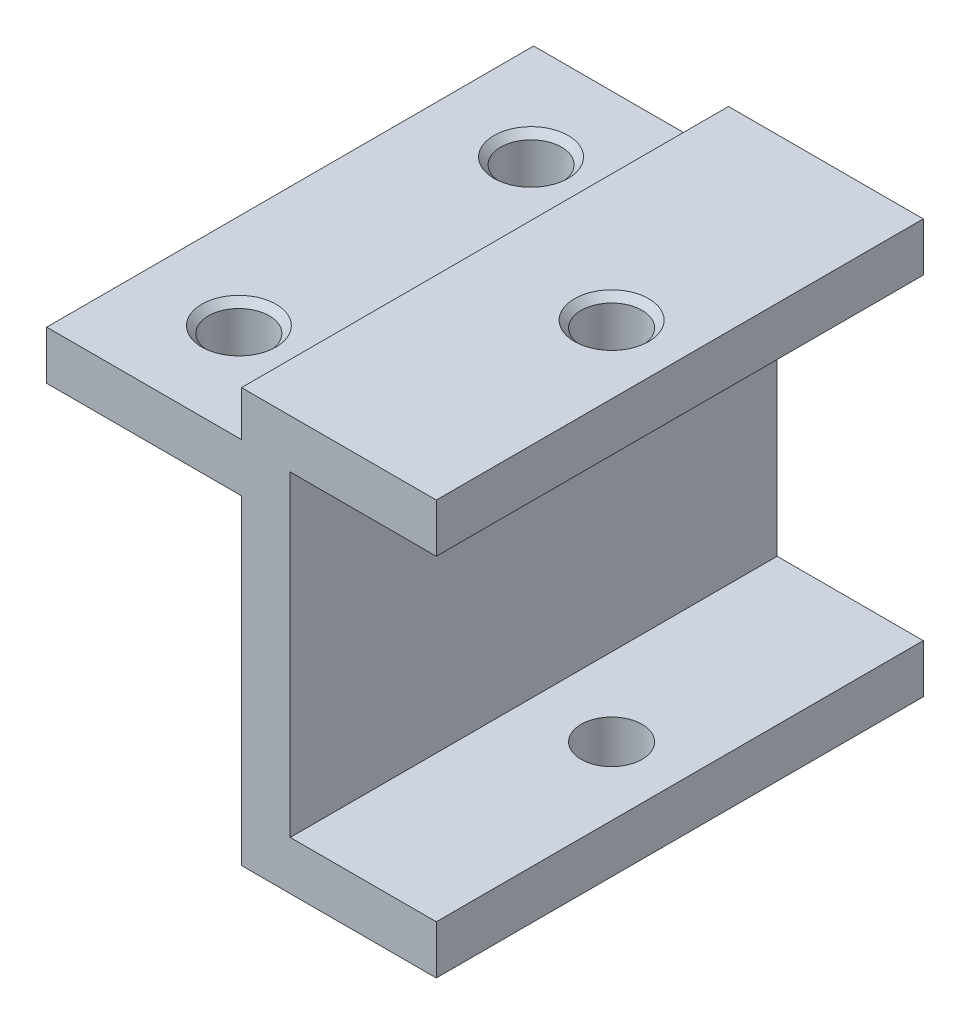
ISO-10303-21;
HEADER;
FILE_DESCRIPTION(('STEP AP214'),'2;1');
FILE_NAME('part.step','',(''),(''),'','','');
FILE_SCHEMA(('AUTOMOTIVE_DESIGN { 1 0 10303 214 1 1 1 1 }'));
ENDSEC;
DATA;
#1=APPLICATION_CONTEXT('core data for automotive mechanical design processes');
#2=APPLICATION_PROTOCOL_DEFINITION('international standard','automotive_design',2000,#1);
#3=PRODUCT_CONTEXT('',#1,'mechanical');
#4=PRODUCT('Part','Part','',(#3));
#5=PRODUCT_RELATED_PRODUCT_CATEGORY('part','',(#4));
#6=PRODUCT_DEFINITION_FORMATION('','',#4);
#7=PRODUCT_DEFINITION_CONTEXT('part definition',#1,'design');
#8=PRODUCT_DEFINITION('design','',#6,#7);
#9=PRODUCT_DEFINITION_SHAPE('','',#8);
#10=(LENGTH_UNIT() NAMED_UNIT(*) SI_UNIT(.MILLI.,.METRE.));
#11=(NAMED_UNIT(*) PLANE_ANGLE_UNIT() SI_UNIT($,.RADIAN.));
#12=(NAMED_UNIT(*) SI_UNIT($,.STERADIAN.) SOLID_ANGLE_UNIT());
#13=UNCERTAINTY_MEASURE_WITH_UNIT(LENGTH_MEASURE(1.E-05),#10,'distance_accuracy_value','');
#14=(GEOMETRIC_REPRESENTATION_CONTEXT(3) GLOBAL_UNCERTAINTY_ASSIGNED_CONTEXT((#13)) GLOBAL_UNIT_ASSIGNED_CONTEXT((#10,
#11,#12)) REPRESENTATION_CONTEXT('',''));
#15=CARTESIAN_POINT('',(0.,0.,0.));
#16=DIRECTION('',(0.,0.,1.));
#17=DIRECTION('',(1.,0.,0.));
#18=AXIS2_PLACEMENT_3D('',#15,#16,#17);
#19=CARTESIAN_POINT('',(4.,5.1,20.));
#20=DIRECTION('',(-1.,0.,0.));
#21=DIRECTION('',(0.,0.,1.));
#22=AXIS2_PLACEMENT_3D('',#19,#20,#21);
#23=PLANE('',#22);
#24=DIRECTION('',(0.,1.,0.));
#25=VECTOR('',#24,1.);
#26=CARTESIAN_POINT('',(4.,5.1,0.));
#27=LINE('',#26,#25);
#28=CARTESIAN_POINT('',(4.,5.1,0.));
#29=VERTEX_POINT('',#28);
#30=CARTESIAN_POINT('',(4.,7.1,0.));
#31=VERTEX_POINT('',#30);
#32=EDGE_CURVE('E156',#29,#31,#27,.T.);
#33=ORIENTED_EDGE('',*,*,#32,.T.);
#34=DIRECTION('',(0.,0.,-1.));
#35=VECTOR('',#34,1.);
#36=CARTESIAN_POINT('',(4.,7.1,20.));
#37=LINE('',#36,#35);
#38=CARTESIAN_POINT('',(4.,7.1,20.));
#39=VERTEX_POINT('',#38);
#40=EDGE_CURVE('E11',#39,#31,#37,.T.);
#41=ORIENTED_EDGE('',*,*,#40,.F.);
#42=DIRECTION('',(0.,1.,0.));
#43=VECTOR('',#42,1.);
#44=CARTESIAN_POINT('',(4.,5.1,20.));
#45=LINE('',#44,#43);
#46=CARTESIAN_POINT('',(4.,5.1,20.));
#47=VERTEX_POINT('',#46);
#48=EDGE_CURVE('E181',#47,#39,#45,.T.);
#49=ORIENTED_EDGE('',*,*,#48,.F.);
#50=DIRECTION('',(0.,0.,-1.));
#51=VECTOR('',#50,1.);
#52=CARTESIAN_POINT('',(4.,5.1,20.));
#53=LINE('',#52,#51);
#54=EDGE_CURVE('E152',#47,#29,#53,.T.);
#55=ORIENTED_EDGE('',*,*,#54,.T.);
#56=EDGE_LOOP('',(#33,#41,#49,#55));
#57=FACE_BOUND('',#56,.T.);
#58=ADVANCED_FACE('F34',(#57),#23,.F.);
#59=CARTESIAN_POINT('',(-4.,7.1,20.));
#60=DIRECTION('',(0.,-1.,0.));
#61=DIRECTION('',(0.,0.,-1.));
#62=AXIS2_PLACEMENT_3D('',#59,#60,#61);
#63=PLANE('',#62);
#64=CARTESIAN_POINT('',(1.2,7.1,10.));
#65=DIRECTION('',(0.,1.,0.));
#66=DIRECTION('',(0.,0.,1.));
#67=AXIS2_PLACEMENT_3D('',#64,#65,#66);
#68=CIRCLE('',#67,1.525);
#69=CARTESIAN_POINT('',(1.2,7.1,11.525));
#70=VERTEX_POINT('',#69);
#71=EDGE_CURVE('E476',#70,#70,#68,.T.);
#72=ORIENTED_EDGE('',*,*,#71,.F.);
#73=EDGE_LOOP('',(#72));
#74=FACE_BOUND('',#73,.T.);
#75=DIRECTION('',(-1.,0.,0.));
#76=VECTOR('',#75,1.);
#77=CARTESIAN_POINT('',(-4.,7.1,0.));
#78=LINE('',#77,#76);
#79=CARTESIAN_POINT('',(-4.,7.1,0.));
#80=VERTEX_POINT('',#79);
#81=EDGE_CURVE('E159',#31,#80,#78,.T.);
#82=ORIENTED_EDGE('',*,*,#81,.T.);
#83=DIRECTION('',(0.,0.,-1.));
#84=VECTOR('',#83,1.);
#85=CARTESIAN_POINT('',(-4.,7.1,20.));
#86=LINE('',#85,#84);
#87=CARTESIAN_POINT('',(-4.,7.1,20.));
#88=VERTEX_POINT('',#87);
#89=EDGE_CURVE('E43',#88,#80,#86,.T.);
#90=ORIENTED_EDGE('',*,*,#89,.F.);
#91=DIRECTION('',(-1.,0.,0.));
#92=VECTOR('',#91,1.);
#93=CARTESIAN_POINT('',(-4.,7.1,20.));
#94=LINE('',#93,#92);
#95=EDGE_CURVE('E105',#39,#88,#94,.T.);
#96=ORIENTED_EDGE('',*,*,#95,.F.);
#97=ORIENTED_EDGE('',*,*,#40,.T.);
#98=EDGE_LOOP('',(#82,#90,#96,#97));
#99=FACE_BOUND('',#98,.T.);
#100=ADVANCED_FACE('F258',(#74,#99),#63,.F.);
#101=CARTESIAN_POINT('',(-4.,5.25,20.));
#102=DIRECTION('',(1.,0.,0.));
#103=DIRECTION('',(0.,1.,0.));
#104=AXIS2_PLACEMENT_3D('',#101,#102,#103);
#105=PLANE('',#104);
#106=DIRECTION('',(0.,-1.,0.));
#107=VECTOR('',#106,1.);
#108=CARTESIAN_POINT('',(-4.,5.25,0.));
#109=LINE('',#108,#107);
#110=CARTESIAN_POINT('',(-4.,5.25,0.));
#111=VERTEX_POINT('',#110);
#112=EDGE_CURVE('E162',#80,#111,#109,.T.);
#113=ORIENTED_EDGE('',*,*,#112,.T.);
#114=DIRECTION('',(0.,0.,-1.));
#115=VECTOR('',#114,1.);
#116=CARTESIAN_POINT('',(-4.,5.25,20.));
#117=LINE('',#116,#115);
#118=CARTESIAN_POINT('',(-4.,5.25,20.));
#119=VERTEX_POINT('',#118);
#120=EDGE_CURVE('E200',#119,#111,#117,.T.);
#121=ORIENTED_EDGE('',*,*,#120,.F.);
#122=DIRECTION('',(0.,-1.,0.));
#123=VECTOR('',#122,1.);
#124=CARTESIAN_POINT('',(-4.,5.25,20.));
#125=LINE('',#124,#123);
#126=EDGE_CURVE('E229',#88,#119,#125,.T.);
#127=ORIENTED_EDGE('',*,*,#126,.F.);
#128=ORIENTED_EDGE('',*,*,#89,.T.);
#129=EDGE_LOOP('',(#113,#121,#127,#128));
#130=FACE_BOUND('',#129,.T.);
#131=ADVANCED_FACE('F261',(#130),#105,.F.);
#132=CARTESIAN_POINT('',(-4.,5.25,20.));
#133=DIRECTION('',(0.,-1.,0.));
#134=DIRECTION('',(1.,0.,0.));
#135=AXIS2_PLACEMENT_3D('',#132,#133,#134);
#136=PLANE('',#135);
#137=CARTESIAN_POINT('',(-8.10837191308821,5.25,4.));
#138=DIRECTION('',(0.,1.,0.));
#139=DIRECTION('',(0.,0.,1.));
#140=AXIS2_PLACEMENT_3D('',#137,#138,#139);
#141=CIRCLE('',#140,1.525);
#142=CARTESIAN_POINT('',(-8.10837191308821,5.25,5.525));
#143=VERTEX_POINT('',#142);
#144=EDGE_CURVE('E216',#143,#143,#141,.T.);
#145=ORIENTED_EDGE('',*,*,#144,.F.);
#146=EDGE_LOOP('',(#145));
#147=FACE_BOUND('',#146,.T.);
#148=CARTESIAN_POINT('',(-8.10837191308821,5.25,16.));
#149=DIRECTION('',(0.,1.,0.));
#150=DIRECTION('',(0.,0.,1.));
#151=AXIS2_PLACEMENT_3D('',#148,#149,#150);
#152=CIRCLE('',#151,1.525);
#153=CARTESIAN_POINT('',(-8.10837191308821,5.25,17.525));
#154=VERTEX_POINT('',#153);
#155=EDGE_CURVE('E209',#154,#154,#152,.T.);
#156=ORIENTED_EDGE('',*,*,#155,.F.);
#157=EDGE_LOOP('',(#156));
#158=FACE_BOUND('',#157,.T.);
#159=DIRECTION('',(-1.,0.,0.));
#160=VECTOR('',#159,1.);
#161=CARTESIAN_POINT('',(-4.,5.25,0.));
#162=LINE('',#161,#160);
#163=CARTESIAN_POINT('',(-12.,5.25,0.));
#164=VERTEX_POINT('',#163);
#165=EDGE_CURVE('E164',#111,#164,#162,.T.);
#166=ORIENTED_EDGE('',*,*,#165,.T.);
#167=DIRECTION('',(0.,0.,-1.));
#168=VECTOR('',#167,1.);
#169=CARTESIAN_POINT('',(-12.,5.25,20.));
#170=LINE('',#169,#168);
#171=CARTESIAN_POINT('',(-12.,5.25,20.));
#172=VERTEX_POINT('',#171);
#173=EDGE_CURVE('E197',#172,#164,#170,.T.);
#174=ORIENTED_EDGE('',*,*,#173,.F.);
#175=DIRECTION('',(-1.,0.,0.));
#176=VECTOR('',#175,1.);
#177=CARTESIAN_POINT('',(-4.,5.25,20.));
#178=LINE('',#177,#176);
#179=EDGE_CURVE('E231',#119,#172,#178,.T.);
#180=ORIENTED_EDGE('',*,*,#179,.F.);
#181=ORIENTED_EDGE('',*,*,#120,.T.);
#182=EDGE_LOOP('',(#166,#174,#180,#181));
#183=FACE_BOUND('',#182,.T.);
#184=ADVANCED_FACE('F266',(#147,#158,#183),#136,.F.);
#185=CARTESIAN_POINT('',(-12.,5.25,20.));
#186=DIRECTION('',(1.,0.,0.));
#187=DIRECTION('',(0.,1.,0.));
#188=AXIS2_PLACEMENT_3D('',#185,#186,#187);
#189=PLANE('',#188);
#190=DIRECTION('',(0.,-1.,0.));
#191=VECTOR('',#190,1.);
#192=CARTESIAN_POINT('',(-12.,5.25,0.));
#193=LINE('',#192,#191);
#194=CARTESIAN_POINT('',(-12.,3.25,0.));
#195=VERTEX_POINT('',#194);
#196=EDGE_CURVE('E166',#164,#195,#193,.T.);
#197=ORIENTED_EDGE('',*,*,#196,.T.);
#198=DIRECTION('',(0.,0.,-1.));
#199=VECTOR('',#198,1.);
#200=CARTESIAN_POINT('',(-12.,3.25,20.));
#201=LINE('',#200,#199);
#202=CARTESIAN_POINT('',(-12.,3.25,20.));
#203=VERTEX_POINT('',#202);
#204=EDGE_CURVE('E194',#203,#195,#201,.T.);
#205=ORIENTED_EDGE('',*,*,#204,.F.);
#206=DIRECTION('',(0.,-1.,0.));
#207=VECTOR('',#206,1.);
#208=CARTESIAN_POINT('',(-12.,5.25,20.));
#209=LINE('',#208,#207);
#210=EDGE_CURVE('E233',#172,#203,#209,.T.);
#211=ORIENTED_EDGE('',*,*,#210,.F.);
#212=ORIENTED_EDGE('',*,*,#173,.T.);
#213=EDGE_LOOP('',(#197,#205,#211,#212));
#214=FACE_BOUND('',#213,.T.);
#215=ADVANCED_FACE('F272',(#214),#189,.F.);
#216=CARTESIAN_POINT('',(-4.,3.25,20.));
#217=DIRECTION('',(0.,1.,0.));
#218=DIRECTION('',(-1.,0.,0.));
#219=AXIS2_PLACEMENT_3D('',#216,#217,#218);
#220=PLANE('',#219);
#221=CARTESIAN_POINT('',(-8.10837191308821,3.25,4.));
#222=DIRECTION('',(0.,1.,0.));
#223=DIRECTION('',(-1.,0.,0.));
#224=AXIS2_PLACEMENT_3D('',#221,#222,#223);
#225=CIRCLE('',#224,1.24999999999999);
#226=CARTESIAN_POINT('',(-9.3583719130882,3.25,4.));
#227=VERTEX_POINT('',#226);
#228=EDGE_CURVE('E207',#227,#227,#225,.T.);
#229=ORIENTED_EDGE('',*,*,#228,.T.);
#230=EDGE_LOOP('',(#229));
#231=FACE_BOUND('',#230,.T.);
#232=CARTESIAN_POINT('',(-8.10837191308821,3.25,16.));
#233=DIRECTION('',(0.,1.,0.));
#234=DIRECTION('',(-1.,0.,0.));
#235=AXIS2_PLACEMENT_3D('',#232,#233,#234);
#236=CIRCLE('',#235,1.24999999999999);
#237=CARTESIAN_POINT('',(-9.3583719130882,3.25,16.));
#238=VERTEX_POINT('',#237);
#239=EDGE_CURVE('E160',#238,#238,#236,.T.);
#240=ORIENTED_EDGE('',*,*,#239,.T.);
#241=EDGE_LOOP('',(#240));
#242=FACE_BOUND('',#241,.T.);
#243=DIRECTION('',(1.,0.,0.));
#244=VECTOR('',#243,1.);
#245=CARTESIAN_POINT('',(-4.,3.25,0.));
#246=LINE('',#245,#244);
#247=CARTESIAN_POINT('',(-4.,3.25,0.));
#248=VERTEX_POINT('',#247);
#249=EDGE_CURVE('E168',#195,#248,#246,.T.);
#250=ORIENTED_EDGE('',*,*,#249,.T.);
#251=DIRECTION('',(0.,0.,-1.));
#252=VECTOR('',#251,1.);
#253=CARTESIAN_POINT('',(-4.,3.25,20.));
#254=LINE('',#253,#252);
#255=CARTESIAN_POINT('',(-4.,3.25,20.));
#256=VERTEX_POINT('',#255);
#257=EDGE_CURVE('E191',#256,#248,#254,.T.);
#258=ORIENTED_EDGE('',*,*,#257,.F.);
#259=DIRECTION('',(1.,0.,0.));
#260=VECTOR('',#259,1.);
#261=CARTESIAN_POINT('',(-4.,3.25,20.));
#262=LINE('',#261,#260);
#263=EDGE_CURVE('E235',#203,#256,#262,.T.);
#264=ORIENTED_EDGE('',*,*,#263,.F.);
#265=ORIENTED_EDGE('',*,*,#204,.T.);
#266=EDGE_LOOP('',(#250,#258,#264,#265));
#267=FACE_BOUND('',#266,.T.);
#268=ADVANCED_FACE('F276',(#231,#242,#267),#220,.F.);
#269=CARTESIAN_POINT('',(-4.,-9.9,20.));
#270=DIRECTION('',(1.,0.,0.));
#271=DIRECTION('',(0.,0.,-1.));
#272=AXIS2_PLACEMENT_3D('',#269,#270,#271);
#273=PLANE('',#272);
#274=DIRECTION('',(0.,-1.,0.));
#275=VECTOR('',#274,1.);
#276=CARTESIAN_POINT('',(-4.,-9.9,0.));
#277=LINE('',#276,#275);
#278=CARTESIAN_POINT('',(-4.,-9.9,0.));
#279=VERTEX_POINT('',#278);
#280=EDGE_CURVE('E170',#248,#279,#277,.T.);
#281=ORIENTED_EDGE('',*,*,#280,.T.);
#282=DIRECTION('',(0.,0.,-1.));
#283=VECTOR('',#282,1.);
#284=CARTESIAN_POINT('',(-4.,-9.9,20.));
#285=LINE('',#284,#283);
#286=CARTESIAN_POINT('',(-4.,-9.9,20.));
#287=VERTEX_POINT('',#286);
#288=EDGE_CURVE('E188',#287,#279,#285,.T.);
#289=ORIENTED_EDGE('',*,*,#288,.F.);
#290=DIRECTION('',(0.,-1.,0.));
#291=VECTOR('',#290,1.);
#292=CARTESIAN_POINT('',(-4.,-9.9,20.));
#293=LINE('',#292,#291);
#294=EDGE_CURVE('E237',#256,#287,#293,.T.);
#295=ORIENTED_EDGE('',*,*,#294,.F.);
#296=ORIENTED_EDGE('',*,*,#257,.T.);
#297=EDGE_LOOP('',(#281,#289,#295,#296));
#298=FACE_BOUND('',#297,.T.);
#299=ADVANCED_FACE('F278',(#298),#273,.F.);
#300=CARTESIAN_POINT('',(-4.,-9.9,20.));
#301=DIRECTION('',(0.,1.,0.));
#302=DIRECTION('',(0.,0.,1.));
#303=AXIS2_PLACEMENT_3D('',#300,#301,#302);
#304=PLANE('',#303);
#305=CARTESIAN_POINT('',(1.2,-9.9,10.));
#306=DIRECTION('',(0.,1.,0.));
#307=DIRECTION('',(0.,0.,1.));
#308=AXIS2_PLACEMENT_3D('',#305,#306,#307);
#309=CIRCLE('',#308,1.25);
#310=CARTESIAN_POINT('',(1.2,-9.9,11.25));
#311=VERTEX_POINT('',#310);
#312=EDGE_CURVE('E467',#311,#311,#309,.T.);
#313=ORIENTED_EDGE('',*,*,#312,.T.);
#314=EDGE_LOOP('',(#313));
#315=FACE_BOUND('',#314,.T.);
#316=DIRECTION('',(1.,0.,0.));
#317=VECTOR('',#316,1.);
#318=CARTESIAN_POINT('',(-4.,-9.9,0.));
#319=LINE('',#318,#317);
#320=CARTESIAN_POINT('',(4.,-9.9,0.));
#321=VERTEX_POINT('',#320);
#322=EDGE_CURVE('E172',#279,#321,#319,.T.);
#323=ORIENTED_EDGE('',*,*,#322,.T.);
#324=DIRECTION('',(0.,0.,-1.));
#325=VECTOR('',#324,1.);
#326=CARTESIAN_POINT('',(4.,-9.9,20.));
#327=LINE('',#326,#325);
#328=CARTESIAN_POINT('',(4.,-9.9,20.));
#329=VERTEX_POINT('',#328);
#330=EDGE_CURVE('E185',#329,#321,#327,.T.);
#331=ORIENTED_EDGE('',*,*,#330,.F.);
#332=DIRECTION('',(1.,0.,0.));
#333=VECTOR('',#332,1.);
#334=CARTESIAN_POINT('',(-4.,-9.9,20.));
#335=LINE('',#334,#333);
#336=EDGE_CURVE('E239',#287,#329,#335,.T.);
#337=ORIENTED_EDGE('',*,*,#336,.F.);
#338=ORIENTED_EDGE('',*,*,#288,.T.);
#339=EDGE_LOOP('',(#323,#331,#337,#338));
#340=FACE_BOUND('',#339,.T.);
#341=ADVANCED_FACE('F245',(#315,#340),#304,.F.);
#342=CARTESIAN_POINT('',(4.,-7.9,20.));
#343=DIRECTION('',(-1.,0.,0.));
#344=DIRECTION('',(0.,-1.,0.));
#345=AXIS2_PLACEMENT_3D('',#342,#343,#344);
#346=PLANE('',#345);
#347=DIRECTION('',(0.,1.,0.));
#348=VECTOR('',#347,1.);
#349=CARTESIAN_POINT('',(4.,-7.9,0.));
#350=LINE('',#349,#348);
#351=CARTESIAN_POINT('',(4.,-7.9,0.));
#352=VERTEX_POINT('',#351);
#353=EDGE_CURVE('E174',#321,#352,#350,.T.);
#354=ORIENTED_EDGE('',*,*,#353,.T.);
#355=DIRECTION('',(0.,0.,-1.));
#356=VECTOR('',#355,1.);
#357=CARTESIAN_POINT('',(4.,-7.9,20.));
#358=LINE('',#357,#356);
#359=CARTESIAN_POINT('',(4.,-7.9,20.));
#360=VERTEX_POINT('',#359);
#361=EDGE_CURVE('E147',#360,#352,#358,.T.);
#362=ORIENTED_EDGE('',*,*,#361,.F.);
#363=DIRECTION('',(0.,1.,0.));
#364=VECTOR('',#363,1.);
#365=CARTESIAN_POINT('',(4.,-7.9,20.));
#366=LINE('',#365,#364);
#367=EDGE_CURVE('E137',#329,#360,#366,.T.);
#368=ORIENTED_EDGE('',*,*,#367,.F.);
#369=ORIENTED_EDGE('',*,*,#330,.T.);
#370=EDGE_LOOP('',(#354,#362,#368,#369));
#371=FACE_BOUND('',#370,.T.);
#372=ADVANCED_FACE('F249',(#371),#346,.F.);
#373=CARTESIAN_POINT('',(-2.,-7.9,20.));
#374=DIRECTION('',(0.,-1.,0.));
#375=DIRECTION('',(0.,0.,-1.));
#376=AXIS2_PLACEMENT_3D('',#373,#374,#375);
#377=PLANE('',#376);
#378=CARTESIAN_POINT('',(1.2,-7.9,10.));
#379=DIRECTION('',(0.,-1.,0.));
#380=DIRECTION('',(0.,0.,-1.));
#381=AXIS2_PLACEMENT_3D('',#378,#379,#380);
#382=CIRCLE('',#381,1.24999999999999);
#383=CARTESIAN_POINT('',(1.2,-7.9,8.75000000000001));
#384=VERTEX_POINT('',#383);
#385=EDGE_CURVE('E221',#384,#384,#382,.T.);
#386=ORIENTED_EDGE('',*,*,#385,.T.);
#387=EDGE_LOOP('',(#386));
#388=FACE_BOUND('',#387,.T.);
#389=DIRECTION('',(-1.,0.,0.));
#390=VECTOR('',#389,1.);
#391=CARTESIAN_POINT('',(-2.,-7.9,0.));
#392=LINE('',#391,#390);
#393=CARTESIAN_POINT('',(-2.,-7.9,0.));
#394=VERTEX_POINT('',#393);
#395=EDGE_CURVE('E145',#352,#394,#392,.T.);
#396=ORIENTED_EDGE('',*,*,#395,.T.);
#397=DIRECTION('',(0.,0.,-1.));
#398=VECTOR('',#397,1.);
#399=CARTESIAN_POINT('',(-2.,-7.9,20.));
#400=LINE('',#399,#398);
#401=CARTESIAN_POINT('',(-2.,-7.9,20.));
#402=VERTEX_POINT('',#401);
#403=EDGE_CURVE('E143',#402,#394,#400,.T.);
#404=ORIENTED_EDGE('',*,*,#403,.F.);
#405=DIRECTION('',(-1.,0.,0.));
#406=VECTOR('',#405,1.);
#407=CARTESIAN_POINT('',(2.,-7.9,20.));
#408=LINE('',#407,#406);
#409=EDGE_CURVE('E130',#360,#402,#408,.T.);
#410=ORIENTED_EDGE('',*,*,#409,.F.);
#411=ORIENTED_EDGE('',*,*,#361,.T.);
#412=EDGE_LOOP('',(#396,#404,#410,#411));
#413=FACE_BOUND('',#412,.T.);
#414=ADVANCED_FACE('F144',(#388,#413),#377,.F.);
#415=CARTESIAN_POINT('',(-2.,-7.9,20.));
#416=DIRECTION('',(-1.,0.,0.));
#417=DIRECTION('',(0.,0.,1.));
#418=AXIS2_PLACEMENT_3D('',#415,#416,#417);
#419=PLANE('',#418);
#420=DIRECTION('',(0.,1.,0.));
#421=VECTOR('',#420,1.);
#422=CARTESIAN_POINT('',(-2.,-7.9,0.));
#423=LINE('',#422,#421);
#424=CARTESIAN_POINT('',(-2.,5.1,0.));
#425=VERTEX_POINT('',#424);
#426=EDGE_CURVE('E178',#394,#425,#423,.T.);
#427=ORIENTED_EDGE('',*,*,#426,.T.);
#428=DIRECTION('',(0.,0.,-1.));
#429=VECTOR('',#428,1.);
#430=CARTESIAN_POINT('',(-2.,5.1,20.));
#431=LINE('',#430,#429);
#432=CARTESIAN_POINT('',(-2.,5.1,20.));
#433=VERTEX_POINT('',#432);
#434=EDGE_CURVE('E148',#433,#425,#431,.T.);
#435=ORIENTED_EDGE('',*,*,#434,.F.);
#436=DIRECTION('',(0.,1.,0.));
#437=VECTOR('',#436,1.);
#438=CARTESIAN_POINT('',(-2.,-7.9,20.));
#439=LINE('',#438,#437);
#440=EDGE_CURVE('E134',#402,#433,#439,.T.);
#441=ORIENTED_EDGE('',*,*,#440,.F.);
#442=ORIENTED_EDGE('',*,*,#403,.T.);
#443=EDGE_LOOP('',(#427,#435,#441,#442));
#444=FACE_BOUND('',#443,.T.);
#445=ADVANCED_FACE('F150',(#444),#419,.F.);
#446=CARTESIAN_POINT('',(2.,5.1,20.));
#447=DIRECTION('',(0.,1.,0.));
#448=DIRECTION('',(0.,0.,1.));
#449=AXIS2_PLACEMENT_3D('',#446,#447,#448);
#450=PLANE('',#449);
#451=CARTESIAN_POINT('',(1.2,5.1,10.));
#452=DIRECTION('',(0.,1.,0.));
#453=DIRECTION('',(0.,0.,1.));
#454=AXIS2_PLACEMENT_3D('',#451,#452,#453);
#455=CIRCLE('',#454,1.24999999999999);
#456=CARTESIAN_POINT('',(1.2,5.1,11.25));
#457=VERTEX_POINT('',#456);
#458=EDGE_CURVE('E37',#457,#457,#455,.T.);
#459=ORIENTED_EDGE('',*,*,#458,.T.);
#460=EDGE_LOOP('',(#459));
#461=FACE_BOUND('',#460,.T.);
#462=DIRECTION('',(1.,0.,0.));
#463=VECTOR('',#462,1.);
#464=CARTESIAN_POINT('',(2.,5.1,0.));
#465=LINE('',#464,#463);
#466=EDGE_CURVE('E93',#425,#29,#465,.T.);
#467=ORIENTED_EDGE('',*,*,#466,.T.);
#468=ORIENTED_EDGE('',*,*,#54,.F.);
#469=DIRECTION('',(1.,0.,0.));
#470=VECTOR('',#469,1.);
#471=CARTESIAN_POINT('',(-2.,5.1,20.));
#472=LINE('',#471,#470);
#473=EDGE_CURVE('E52',#433,#47,#472,.T.);
#474=ORIENTED_EDGE('',*,*,#473,.F.);
#475=ORIENTED_EDGE('',*,*,#434,.T.);
#476=EDGE_LOOP('',(#467,#468,#474,#475));
#477=FACE_BOUND('',#476,.T.);
#478=ADVANCED_FACE('F252',(#461,#477),#450,.F.);
#479=CARTESIAN_POINT('',(0.,0.,20.));
#480=DIRECTION('',(0.,0.,-1.));
#481=DIRECTION('',(-1.,0.,0.));
#482=AXIS2_PLACEMENT_3D('',#479,#480,#481);
#483=PLANE('',#482);
#484=ORIENTED_EDGE('',*,*,#48,.T.);
#485=ORIENTED_EDGE('',*,*,#95,.T.);
#486=ORIENTED_EDGE('',*,*,#126,.T.);
#487=ORIENTED_EDGE('',*,*,#179,.T.);
#488=ORIENTED_EDGE('',*,*,#210,.T.);
#489=ORIENTED_EDGE('',*,*,#263,.T.);
#490=ORIENTED_EDGE('',*,*,#294,.T.);
#491=ORIENTED_EDGE('',*,*,#336,.T.);
#492=ORIENTED_EDGE('',*,*,#367,.T.);
#493=ORIENTED_EDGE('',*,*,#409,.T.);
#494=ORIENTED_EDGE('',*,*,#440,.T.);
#495=ORIENTED_EDGE('',*,*,#473,.T.);
#496=EDGE_LOOP('',(#484,#485,#486,#487,#488,#489,#490,#491,#492,#493,#494,#495));
#497=FACE_BOUND('',#496,.T.);
#498=ADVANCED_FACE('F132',(#497),#483,.F.);
#499=CARTESIAN_POINT('',(0.,0.,0.));
#500=DIRECTION('',(0.,0.,-1.));
#501=DIRECTION('',(-1.,0.,0.));
#502=AXIS2_PLACEMENT_3D('',#499,#500,#501);
#503=PLANE('',#502);
#504=ORIENTED_EDGE('',*,*,#32,.F.);
#505=ORIENTED_EDGE('',*,*,#466,.F.);
#506=ORIENTED_EDGE('',*,*,#426,.F.);
#507=ORIENTED_EDGE('',*,*,#395,.F.);
#508=ORIENTED_EDGE('',*,*,#353,.F.);
#509=ORIENTED_EDGE('',*,*,#322,.F.);
#510=ORIENTED_EDGE('',*,*,#280,.F.);
#511=ORIENTED_EDGE('',*,*,#249,.F.);
#512=ORIENTED_EDGE('',*,*,#196,.F.);
#513=ORIENTED_EDGE('',*,*,#165,.F.);
#514=ORIENTED_EDGE('',*,*,#112,.F.);
#515=ORIENTED_EDGE('',*,*,#81,.F.);
#516=EDGE_LOOP('',(#504,#505,#506,#507,#508,#509,#510,#511,#512,#513,#514,#515));
#517=FACE_BOUND('',#516,.T.);
#518=ADVANCED_FACE('F250',(#517),#503,.T.);
#519=CARTESIAN_POINT('',(-8.10837191308821,5.25,16.));
#520=DIRECTION('',(0.,1.,0.));
#521=DIRECTION('',(0.,0.,1.));
#522=AXIS2_PLACEMENT_3D('',#519,#520,#521);
#523=CYLINDRICAL_SURFACE('',#522,1.24999999999999);
#524=CARTESIAN_POINT('',(-8.10837191308821,4.975,16.));
#525=DIRECTION('',(0.,1.,0.));
#526=DIRECTION('',(0.,0.,1.));
#527=AXIS2_PLACEMENT_3D('',#524,#525,#526);
#528=CIRCLE('',#527,1.24999999999999);
#529=CARTESIAN_POINT('',(-8.10837191308821,4.975,17.25));
#530=VERTEX_POINT('',#529);
#531=EDGE_CURVE('E206',#530,#530,#528,.T.);
#532=ORIENTED_EDGE('',*,*,#531,.T.);
#533=EDGE_LOOP('',(#532));
#534=FACE_BOUND('',#533,.T.);
#535=ORIENTED_EDGE('',*,*,#239,.F.);
#536=EDGE_LOOP('',(#535));
#537=FACE_BOUND('',#536,.T.);
#538=ADVANCED_FACE('F321',(#534,#537),#523,.F.);
#539=CARTESIAN_POINT('',(-8.10837191308821,5.25,16.));
#540=DIRECTION('',(0.,1.,0.));
#541=DIRECTION('',(0.,0.,1.));
#542=AXIS2_PLACEMENT_3D('',#539,#540,#541);
#543=CONICAL_SURFACE('',#542,1.525,0.785398163397451);
#544=ORIENTED_EDGE('',*,*,#531,.F.);
#545=EDGE_LOOP('',(#544));
#546=FACE_BOUND('',#545,.T.);
#547=ORIENTED_EDGE('',*,*,#155,.T.);
#548=EDGE_LOOP('',(#547));
#549=FACE_BOUND('',#548,.T.);
#550=ADVANCED_FACE('F327',(#546,#549),#543,.F.);
#551=CARTESIAN_POINT('',(-8.10837191308821,5.25,4.));
#552=DIRECTION('',(0.,1.,0.));
#553=DIRECTION('',(0.,0.,1.));
#554=AXIS2_PLACEMENT_3D('',#551,#552,#553);
#555=CYLINDRICAL_SURFACE('',#554,1.24999999999999);
#556=CARTESIAN_POINT('',(-8.10837191308821,4.975,4.));
#557=DIRECTION('',(0.,1.,0.));
#558=DIRECTION('',(0.,0.,1.));
#559=AXIS2_PLACEMENT_3D('',#556,#557,#558);
#560=CIRCLE('',#559,1.24999999999999);
#561=CARTESIAN_POINT('',(-8.10837191308821,4.975,5.24999999999999));
#562=VERTEX_POINT('',#561);
#563=EDGE_CURVE('E210',#562,#562,#560,.T.);
#564=ORIENTED_EDGE('',*,*,#563,.T.);
#565=EDGE_LOOP('',(#564));
#566=FACE_BOUND('',#565,.T.);
#567=ORIENTED_EDGE('',*,*,#228,.F.);
#568=EDGE_LOOP('',(#567));
#569=FACE_BOUND('',#568,.T.);
#570=ADVANCED_FACE('F340',(#566,#569),#555,.F.);
#571=CARTESIAN_POINT('',(-8.10837191308821,5.25,4.));
#572=DIRECTION('',(0.,1.,0.));
#573=DIRECTION('',(0.,0.,1.));
#574=AXIS2_PLACEMENT_3D('',#571,#572,#573);
#575=CONICAL_SURFACE('',#574,1.525,0.785398163397451);
#576=ORIENTED_EDGE('',*,*,#563,.F.);
#577=EDGE_LOOP('',(#576));
#578=FACE_BOUND('',#577,.T.);
#579=ORIENTED_EDGE('',*,*,#144,.T.);
#580=EDGE_LOOP('',(#579));
#581=FACE_BOUND('',#580,.T.);
#582=ADVANCED_FACE('F350',(#578,#581),#575,.F.);
#583=CARTESIAN_POINT('',(1.2,7.1,10.));
#584=DIRECTION('',(0.,1.,0.));
#585=DIRECTION('',(0.,0.,1.));
#586=AXIS2_PLACEMENT_3D('',#583,#584,#585);
#587=CYLINDRICAL_SURFACE('',#586,1.24999999999999);
#588=CARTESIAN_POINT('',(1.2,6.82499999999999,10.));
#589=DIRECTION('',(0.,1.,0.));
#590=DIRECTION('',(0.,0.,1.));
#591=AXIS2_PLACEMENT_3D('',#588,#589,#590);
#592=CIRCLE('',#591,1.24999999999999);
#593=CARTESIAN_POINT('',(1.2,6.82499999999999,11.25));
#594=VERTEX_POINT('',#593);
#595=EDGE_CURVE('E473',#594,#594,#592,.T.);
#596=ORIENTED_EDGE('',*,*,#595,.T.);
#597=EDGE_LOOP('',(#596));
#598=FACE_BOUND('',#597,.T.);
#599=ORIENTED_EDGE('',*,*,#458,.F.);
#600=EDGE_LOOP('',(#599));
#601=FACE_BOUND('',#600,.T.);
#602=ADVANCED_FACE('F358',(#598,#601),#587,.F.);
#603=CARTESIAN_POINT('',(1.2,7.1,10.));
#604=DIRECTION('',(0.,1.,0.));
#605=DIRECTION('',(0.,0.,1.));
#606=AXIS2_PLACEMENT_3D('',#603,#604,#605);
#607=CONICAL_SURFACE('',#606,1.525,0.785398163397448);
#608=ORIENTED_EDGE('',*,*,#595,.F.);
#609=EDGE_LOOP('',(#608));
#610=FACE_BOUND('',#609,.T.);
#611=ORIENTED_EDGE('',*,*,#71,.T.);
#612=EDGE_LOOP('',(#611));
#613=FACE_BOUND('',#612,.T.);
#614=ADVANCED_FACE('F408',(#610,#613),#607,.F.);
#615=ORIENTED_EDGE('',*,*,#312,.F.);
#616=EDGE_LOOP('',(#615));
#617=FACE_BOUND('',#616,.T.);
#618=ORIENTED_EDGE('',*,*,#385,.F.);
#619=EDGE_LOOP('',(#618));
#620=FACE_BOUND('',#619,.T.);
#621=ADVANCED_FACE('F411',(#617,#620),#587,.F.);
#622=CLOSED_SHELL('',(#58,#100,#131,#184,#215,#268,#299,#341,#372,#414,#445,#478,#498,#518,#538,
#550,#570,#582,#602,#614,#621));
#623=MANIFOLD_SOLID_BREP('B2',#622);
#624=ADVANCED_BREP_SHAPE_REPRESENTATION('',(#18,#623),#14);
#625=SHAPE_DEFINITION_REPRESENTATION(#9,#624);
ENDSEC;
END-ISO-10303-21;
